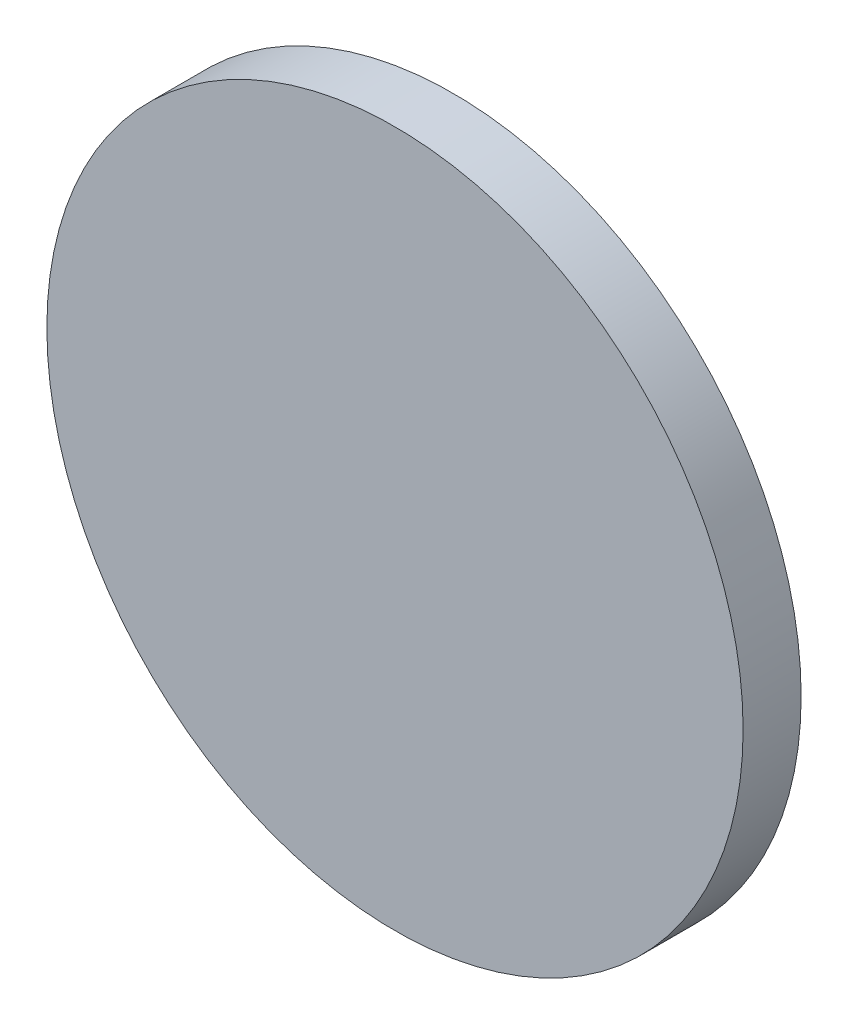
ISO-10303-21;
HEADER;
FILE_DESCRIPTION(('STEP AP214'),'2;1');
FILE_NAME('part.step','',(''),(''),'','','');
FILE_SCHEMA(('AUTOMOTIVE_DESIGN { 1 0 10303 214 1 1 1 1 }'));
ENDSEC;
DATA;
#1=APPLICATION_CONTEXT('core data for automotive mechanical design processes');
#2=APPLICATION_PROTOCOL_DEFINITION('international standard','automotive_design',2000,#1);
#3=PRODUCT_CONTEXT('',#1,'mechanical');
#4=PRODUCT('Part','Part','',(#3));
#5=PRODUCT_RELATED_PRODUCT_CATEGORY('part','',(#4));
#6=PRODUCT_DEFINITION_FORMATION('','',#4);
#7=PRODUCT_DEFINITION_CONTEXT('part definition',#1,'design');
#8=PRODUCT_DEFINITION('design','',#6,#7);
#9=PRODUCT_DEFINITION_SHAPE('','',#8);
#10=(LENGTH_UNIT() NAMED_UNIT(*) SI_UNIT(.MILLI.,.METRE.));
#11=(NAMED_UNIT(*) PLANE_ANGLE_UNIT() SI_UNIT($,.RADIAN.));
#12=(NAMED_UNIT(*) SI_UNIT($,.STERADIAN.) SOLID_ANGLE_UNIT());
#13=UNCERTAINTY_MEASURE_WITH_UNIT(LENGTH_MEASURE(1.E-05),#10,'distance_accuracy_value','');
#14=(GEOMETRIC_REPRESENTATION_CONTEXT(3) GLOBAL_UNCERTAINTY_ASSIGNED_CONTEXT((#13)) GLOBAL_UNIT_ASSIGNED_CONTEXT((#10,
#11,#12)) REPRESENTATION_CONTEXT('',''));
#15=CARTESIAN_POINT('',(0.,0.,0.));
#16=DIRECTION('',(0.,0.,1.));
#17=DIRECTION('',(1.,0.,0.));
#18=AXIS2_PLACEMENT_3D('',#15,#16,#17);
#19=CARTESIAN_POINT('',(0.,0.,19.05));
#20=DIRECTION('',(0.,0.,-1.));
#21=DIRECTION('',(-1.,0.,0.));
#22=AXIS2_PLACEMENT_3D('',#19,#20,#21);
#23=CYLINDRICAL_SURFACE('',#22,114.3);
#24=CARTESIAN_POINT('',(0.,0.,19.05));
#25=DIRECTION('',(0.,0.,1.));
#26=DIRECTION('',(1.,0.,0.));
#27=AXIS2_PLACEMENT_3D('',#24,#25,#26);
#28=CIRCLE('',#27,114.3);
#29=CARTESIAN_POINT('',(-114.3,0.,19.05));
#30=VERTEX_POINT('',#29);
#31=EDGE_CURVE('E10',#30,#30,#28,.T.);
#32=CARTESIAN_POINT('',(0.,0.,0.));
#33=DIRECTION('',(0.,0.,1.));
#34=DIRECTION('',(1.,0.,0.));
#35=AXIS2_PLACEMENT_3D('',#32,#33,#34);
#36=CIRCLE('',#35,114.3);
#37=CARTESIAN_POINT('',(-114.3,0.,0.));
#38=VERTEX_POINT('',#37);
#39=EDGE_CURVE('E37',#38,#38,#36,.T.);
#40=CARTESIAN_POINT('',(-114.3,0.,19.05));
#41=CARTESIAN_POINT('',(-114.3,0.,18.8515625));
#42=CARTESIAN_POINT('',(-114.3,0.,18.653125));
#43=CARTESIAN_POINT('',(-114.3,0.,18.25625));
#44=CARTESIAN_POINT('',(-114.3,0.,18.0578125));
#45=CARTESIAN_POINT('',(-114.3,0.,17.6609375));
#46=CARTESIAN_POINT('',(-114.3,0.,17.4625));
#47=CARTESIAN_POINT('',(-114.3,0.,17.065625));
#48=CARTESIAN_POINT('',(-114.3,0.,16.8671875));
#49=CARTESIAN_POINT('',(-114.3,0.,16.4703125));
#50=CARTESIAN_POINT('',(-114.3,0.,16.271875));
#51=CARTESIAN_POINT('',(-114.3,0.,15.875));
#52=CARTESIAN_POINT('',(-114.3,0.,15.6765625));
#53=CARTESIAN_POINT('',(-114.3,0.,15.2796875));
#54=CARTESIAN_POINT('',(-114.3,0.,15.08125));
#55=CARTESIAN_POINT('',(-114.3,0.,14.684375));
#56=CARTESIAN_POINT('',(-114.3,0.,14.4859375));
#57=CARTESIAN_POINT('',(-114.3,0.,14.0890625));
#58=CARTESIAN_POINT('',(-114.3,0.,13.890625));
#59=CARTESIAN_POINT('',(-114.3,0.,13.49375));
#60=CARTESIAN_POINT('',(-114.3,0.,13.2953125));
#61=CARTESIAN_POINT('',(-114.3,0.,12.8984375));
#62=CARTESIAN_POINT('',(-114.3,0.,12.7));
#63=CARTESIAN_POINT('',(-114.3,0.,12.303125));
#64=CARTESIAN_POINT('',(-114.3,0.,12.1046875));
#65=CARTESIAN_POINT('',(-114.3,0.,11.7078125));
#66=CARTESIAN_POINT('',(-114.3,0.,11.509375));
#67=CARTESIAN_POINT('',(-114.3,0.,11.1125));
#68=CARTESIAN_POINT('',(-114.3,0.,10.9140625));
#69=CARTESIAN_POINT('',(-114.3,0.,10.5171875));
#70=CARTESIAN_POINT('',(-114.3,0.,10.31875));
#71=CARTESIAN_POINT('',(-114.3,0.,9.921875));
#72=CARTESIAN_POINT('',(-114.3,0.,9.7234375));
#73=CARTESIAN_POINT('',(-114.3,0.,9.3265625));
#74=CARTESIAN_POINT('',(-114.3,0.,9.128125));
#75=CARTESIAN_POINT('',(-114.3,0.,8.73125));
#76=CARTESIAN_POINT('',(-114.3,0.,8.5328125));
#77=CARTESIAN_POINT('',(-114.3,0.,8.1359375));
#78=CARTESIAN_POINT('',(-114.3,0.,7.9375));
#79=CARTESIAN_POINT('',(-114.3,0.,7.540625));
#80=CARTESIAN_POINT('',(-114.3,0.,7.3421875));
#81=CARTESIAN_POINT('',(-114.3,0.,6.9453125));
#82=CARTESIAN_POINT('',(-114.3,0.,6.746875));
#83=CARTESIAN_POINT('',(-114.3,0.,6.35));
#84=CARTESIAN_POINT('',(-114.3,0.,6.1515625));
#85=CARTESIAN_POINT('',(-114.3,0.,5.7546875));
#86=CARTESIAN_POINT('',(-114.3,0.,5.55625));
#87=CARTESIAN_POINT('',(-114.3,0.,5.159375));
#88=CARTESIAN_POINT('',(-114.3,0.,4.9609375));
#89=CARTESIAN_POINT('',(-114.3,0.,4.5640625));
#90=CARTESIAN_POINT('',(-114.3,0.,4.365625));
#91=CARTESIAN_POINT('',(-114.3,0.,3.96875));
#92=CARTESIAN_POINT('',(-114.3,0.,3.7703125));
#93=CARTESIAN_POINT('',(-114.3,0.,3.3734375));
#94=CARTESIAN_POINT('',(-114.3,0.,3.175));
#95=CARTESIAN_POINT('',(-114.3,0.,2.778125));
#96=CARTESIAN_POINT('',(-114.3,0.,2.5796875));
#97=CARTESIAN_POINT('',(-114.3,0.,2.1828125));
#98=CARTESIAN_POINT('',(-114.3,0.,1.984375));
#99=CARTESIAN_POINT('',(-114.3,0.,1.5875));
#100=CARTESIAN_POINT('',(-114.3,0.,1.3890625));
#101=CARTESIAN_POINT('',(-114.3,0.,0.992187500000001));
#102=CARTESIAN_POINT('',(-114.3,0.,0.793750000000001));
#103=CARTESIAN_POINT('',(-114.3,0.,0.396875));
#104=CARTESIAN_POINT('',(-114.3,0.,0.1984375));
#105=CARTESIAN_POINT('',(-114.3,0.,0.));
#106=B_SPLINE_CURVE_WITH_KNOTS('',3,(#40,#41,#42,#43,#44,#45,#46,#47,#48,#49,#50,#51,#52,#53,
#54,#55,#56,#57,#58,#59,#60,#61,#62,#63,#64,#65,#66,#67,#68,#69,#70,#71,#72,#73,#74,#75,#76,#77,
#78,#79,#80,#81,#82,#83,#84,#85,#86,#87,#88,#89,#90,#91,#92,#93,#94,#95,#96,#97,#98,#99,#100,
#101,#102,#103,#104,#105),.UNSPECIFIED.,.F.,.F.,(4,2,2,2,2,2,2,2,2,2,2,2,2,2,2,2,2,2,2,2,2,2,2,
2,2,2,2,2,2,2,2,2,4),(0.,0.5953125,1.190625,1.7859375,2.38125,2.9765625,3.571875,4.1671875,
4.7625,5.3578125,5.953125,6.5484375,7.14375,7.7390625,8.334375,8.9296875,9.525,10.1203125,
10.715625,11.3109375,11.90625,12.5015625,13.096875,13.6921875,14.2875,14.8828125,15.478125,
16.0734375,16.66875,17.2640625,17.859375,18.4546875,19.05),.UNSPECIFIED.);
#107=EDGE_CURVE('BSEAM31',#30,#38,#106,.T.);
#108=ORIENTED_EDGE('',*,*,#31,.F.);
#109=ORIENTED_EDGE('',*,*,#39,.T.);
#110=ORIENTED_EDGE('',*,*,#107,.T.);
#111=ORIENTED_EDGE('',*,*,#107,.F.);
#112=EDGE_LOOP('',(#108,#110,#109,#111));
#113=FACE_BOUND('',#112,.T.);
#114=ADVANCED_FACE('F31',(#113),#23,.T.);
#115=CARTESIAN_POINT('',(0.,0.,19.05));
#116=DIRECTION('',(0.,0.,1.));
#117=DIRECTION('',(1.,0.,0.));
#118=AXIS2_PLACEMENT_3D('',#115,#116,#117);
#119=PLANE('',#118);
#120=ORIENTED_EDGE('',*,*,#31,.T.);
#121=EDGE_LOOP('',(#120));
#122=FACE_BOUND('',#121,.T.);
#123=ADVANCED_FACE('F46',(#122),#119,.T.);
#124=CARTESIAN_POINT('',(0.,0.,0.));
#125=DIRECTION('',(0.,0.,1.));
#126=DIRECTION('',(1.,0.,0.));
#127=AXIS2_PLACEMENT_3D('',#124,#125,#126);
#128=PLANE('',#127);
#129=ORIENTED_EDGE('',*,*,#39,.F.);
#130=EDGE_LOOP('',(#129));
#131=FACE_BOUND('',#130,.T.);
#132=ADVANCED_FACE('F44',(#131),#128,.F.);
#133=CLOSED_SHELL('',(#114,#123,#132));
#134=MANIFOLD_SOLID_BREP('B2',#133);
#135=ADVANCED_BREP_SHAPE_REPRESENTATION('',(#18,#134),#14);
#136=SHAPE_DEFINITION_REPRESENTATION(#9,#135);
ENDSEC;
END-ISO-10303-21;
